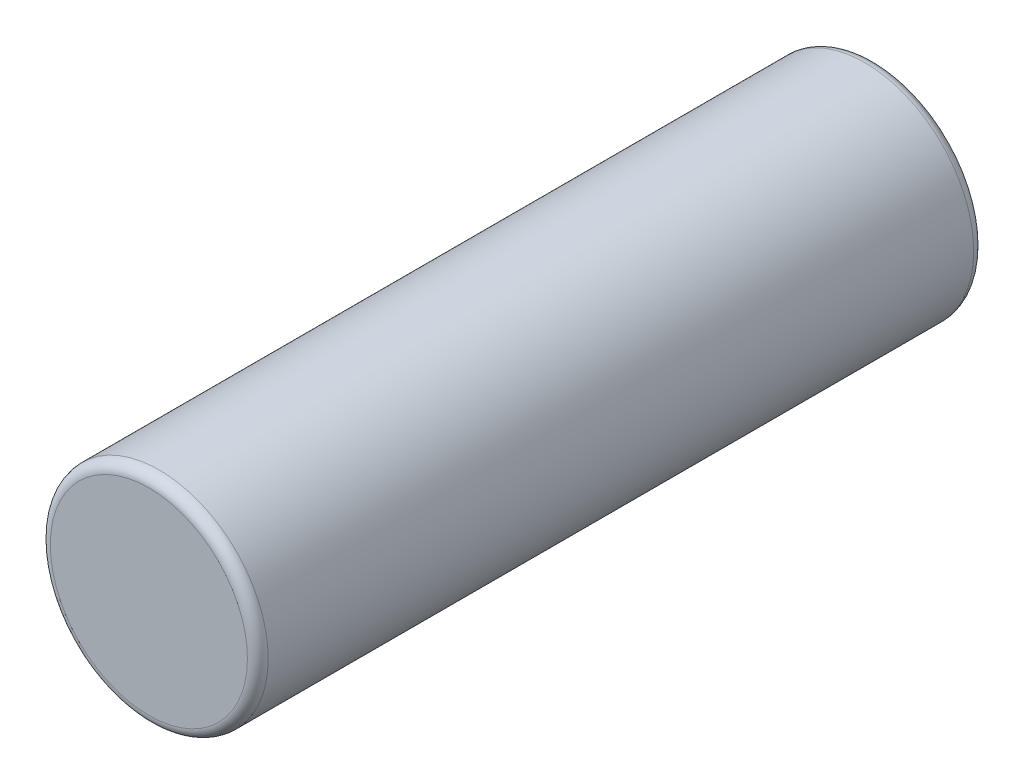
ISO-10303-21;
HEADER;
FILE_DESCRIPTION(('STEP AP214'),'2;1');
FILE_NAME('part.step','',(''),(''),'','','');
FILE_SCHEMA(('AUTOMOTIVE_DESIGN { 1 0 10303 214 1 1 1 1 }'));
ENDSEC;
DATA;
#1=APPLICATION_CONTEXT('core data for automotive mechanical design processes');
#2=APPLICATION_PROTOCOL_DEFINITION('international standard','automotive_design',2000,#1);
#3=PRODUCT_CONTEXT('',#1,'mechanical');
#4=PRODUCT('Part','Part','',(#3));
#5=PRODUCT_RELATED_PRODUCT_CATEGORY('part','',(#4));
#6=PRODUCT_DEFINITION_FORMATION('','',#4);
#7=PRODUCT_DEFINITION_CONTEXT('part definition',#1,'design');
#8=PRODUCT_DEFINITION('design','',#6,#7);
#9=PRODUCT_DEFINITION_SHAPE('','',#8);
#10=(LENGTH_UNIT() NAMED_UNIT(*) SI_UNIT(.MILLI.,.METRE.));
#11=(NAMED_UNIT(*) PLANE_ANGLE_UNIT() SI_UNIT($,.RADIAN.));
#12=(NAMED_UNIT(*) SI_UNIT($,.STERADIAN.) SOLID_ANGLE_UNIT());
#13=UNCERTAINTY_MEASURE_WITH_UNIT(LENGTH_MEASURE(1.E-05),#10,'distance_accuracy_value','');
#14=(GEOMETRIC_REPRESENTATION_CONTEXT(3) GLOBAL_UNCERTAINTY_ASSIGNED_CONTEXT((#13)) GLOBAL_UNIT_ASSIGNED_CONTEXT((#10,
#11,#12)) REPRESENTATION_CONTEXT('',''));
#15=CARTESIAN_POINT('',(0.,0.,0.));
#16=DIRECTION('',(0.,0.,1.));
#17=DIRECTION('',(1.,0.,0.));
#18=AXIS2_PLACEMENT_3D('',#15,#16,#17);
#19=CARTESIAN_POINT('',(0.,0.,70.));
#20=DIRECTION('',(0.,0.,-1.));
#21=DIRECTION('',(-1.,0.,0.));
#22=AXIS2_PLACEMENT_3D('',#19,#20,#21);
#23=CYLINDRICAL_SURFACE('',#22,10.5);
#24=CARTESIAN_POINT('',(0.,0.,1.));
#25=DIRECTION('',(0.,0.,1.));
#26=DIRECTION('',(1.,0.,0.));
#27=AXIS2_PLACEMENT_3D('',#24,#25,#26);
#28=CIRCLE('',#27,10.5);
#29=CARTESIAN_POINT('',(10.5,0.,1.));
#30=VERTEX_POINT('',#29);
#31=EDGE_CURVE('E51',#30,#30,#28,.T.);
#32=ORIENTED_EDGE('',*,*,#31,.T.);
#33=EDGE_LOOP('',(#32));
#34=FACE_BOUND('',#33,.T.);
#35=CARTESIAN_POINT('',(0.,0.,69.));
#36=DIRECTION('',(0.,0.,1.));
#37=DIRECTION('',(1.,0.,0.));
#38=AXIS2_PLACEMENT_3D('',#35,#36,#37);
#39=CIRCLE('',#38,10.5);
#40=CARTESIAN_POINT('',(10.5,0.,69.));
#41=VERTEX_POINT('',#40);
#42=EDGE_CURVE('E55',#41,#41,#39,.F.);
#43=ORIENTED_EDGE('',*,*,#42,.T.);
#44=EDGE_LOOP('',(#43));
#45=FACE_BOUND('',#44,.T.);
#46=ADVANCED_FACE('F40',(#34,#45),#23,.T.);
#47=CARTESIAN_POINT('',(0.,0.,70.));
#48=DIRECTION('',(0.,0.,1.));
#49=DIRECTION('',(1.,0.,0.));
#50=AXIS2_PLACEMENT_3D('',#47,#48,#49);
#51=PLANE('',#50);
#52=CARTESIAN_POINT('',(0.,0.,70.));
#53=DIRECTION('',(0.,0.,1.));
#54=DIRECTION('',(1.,0.,0.));
#55=AXIS2_PLACEMENT_3D('',#52,#53,#54);
#56=CIRCLE('',#55,9.5);
#57=CARTESIAN_POINT('',(9.5,0.,70.));
#58=VERTEX_POINT('',#57);
#59=EDGE_CURVE('E10',#58,#58,#56,.T.);
#60=ORIENTED_EDGE('',*,*,#59,.T.);
#61=EDGE_LOOP('',(#60));
#62=FACE_BOUND('',#61,.T.);
#63=ADVANCED_FACE('F71',(#62),#51,.T.);
#64=CARTESIAN_POINT('',(0.,0.,0.));
#65=DIRECTION('',(0.,0.,1.));
#66=DIRECTION('',(1.,0.,0.));
#67=AXIS2_PLACEMENT_3D('',#64,#65,#66);
#68=PLANE('',#67);
#69=CARTESIAN_POINT('',(0.,0.,0.));
#70=DIRECTION('',(0.,0.,1.));
#71=DIRECTION('',(1.,0.,0.));
#72=AXIS2_PLACEMENT_3D('',#69,#70,#71);
#73=CIRCLE('',#72,9.5);
#74=CARTESIAN_POINT('',(9.5,0.,0.));
#75=VERTEX_POINT('',#74);
#76=EDGE_CURVE('E47',#75,#75,#73,.F.);
#77=ORIENTED_EDGE('',*,*,#76,.T.);
#78=EDGE_LOOP('',(#77));
#79=FACE_BOUND('',#78,.T.);
#80=ADVANCED_FACE('F68',(#79),#68,.F.);
#81=CARTESIAN_POINT('',(0.,0.,1.));
#82=DIRECTION('',(0.,0.,1.));
#83=DIRECTION('',(1.,0.,0.));
#84=AXIS2_PLACEMENT_3D('',#81,#82,#83);
#85=TOROIDAL_SURFACE('',#84,9.5,1.);
#86=ORIENTED_EDGE('',*,*,#76,.F.);
#87=EDGE_LOOP('',(#86));
#88=FACE_BOUND('',#87,.T.);
#89=ORIENTED_EDGE('',*,*,#31,.F.);
#90=EDGE_LOOP('',(#89));
#91=FACE_BOUND('',#90,.T.);
#92=ADVANCED_FACE('F64',(#88,#91),#85,.T.);
#93=CARTESIAN_POINT('',(0.,0.,69.));
#94=DIRECTION('',(0.,0.,1.));
#95=DIRECTION('',(1.,0.,0.));
#96=AXIS2_PLACEMENT_3D('',#93,#94,#95);
#97=TOROIDAL_SURFACE('',#96,9.5,1.);
#98=ORIENTED_EDGE('',*,*,#42,.F.);
#99=EDGE_LOOP('',(#98));
#100=FACE_BOUND('',#99,.T.);
#101=ORIENTED_EDGE('',*,*,#59,.F.);
#102=EDGE_LOOP('',(#101));
#103=FACE_BOUND('',#102,.T.);
#104=ADVANCED_FACE('F42',(#100,#103),#97,.T.);
#105=CLOSED_SHELL('',(#46,#63,#80,#92,#104));
#106=MANIFOLD_SOLID_BREP('B2',#105);
#107=ADVANCED_BREP_SHAPE_REPRESENTATION('',(#18,#106),#14);
#108=SHAPE_DEFINITION_REPRESENTATION(#9,#107);
ENDSEC;
END-ISO-10303-21;
